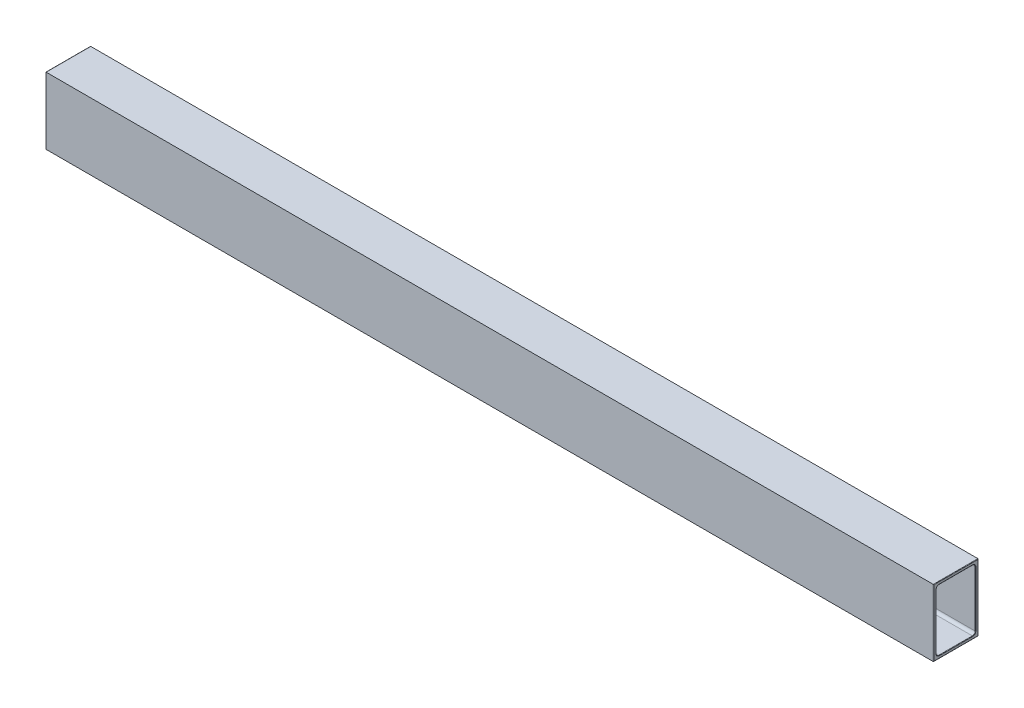
ISO-10303-21;
HEADER;
FILE_DESCRIPTION(('STEP AP214'),'2;1');
FILE_NAME('part.step','',(''),(''),'','','');
FILE_SCHEMA(('AUTOMOTIVE_DESIGN { 1 0 10303 214 1 1 1 1 }'));
ENDSEC;
DATA;
#1=APPLICATION_CONTEXT('core data for automotive mechanical design processes');
#2=APPLICATION_PROTOCOL_DEFINITION('international standard','automotive_design',2000,#1);
#3=PRODUCT_CONTEXT('',#1,'mechanical');
#4=PRODUCT('Part','Part','',(#3));
#5=PRODUCT_RELATED_PRODUCT_CATEGORY('part','',(#4));
#6=PRODUCT_DEFINITION_FORMATION('','',#4);
#7=PRODUCT_DEFINITION_CONTEXT('part definition',#1,'design');
#8=PRODUCT_DEFINITION('design','',#6,#7);
#9=PRODUCT_DEFINITION_SHAPE('','',#8);
#10=(LENGTH_UNIT() NAMED_UNIT(*) SI_UNIT(.MILLI.,.METRE.));
#11=(NAMED_UNIT(*) PLANE_ANGLE_UNIT() SI_UNIT($,.RADIAN.));
#12=(NAMED_UNIT(*) SI_UNIT($,.STERADIAN.) SOLID_ANGLE_UNIT());
#13=UNCERTAINTY_MEASURE_WITH_UNIT(LENGTH_MEASURE(1.E-05),#10,'distance_accuracy_value','');
#14=(GEOMETRIC_REPRESENTATION_CONTEXT(3) GLOBAL_UNCERTAINTY_ASSIGNED_CONTEXT((#13)) GLOBAL_UNIT_ASSIGNED_CONTEXT((#10,
#11,#12)) REPRESENTATION_CONTEXT('',''));
#15=CARTESIAN_POINT('',(0.,0.,0.));
#16=DIRECTION('',(0.,0.,1.));
#17=DIRECTION('',(1.,0.,0.));
#18=AXIS2_PLACEMENT_3D('',#15,#16,#17);
#19=CARTESIAN_POINT('',(2022.60499974,0.,0.));
#20=DIRECTION('',(0.,1.,0.));
#21=DIRECTION('',(0.,0.,1.));
#22=AXIS2_PLACEMENT_3D('',#19,#20,#21);
#23=PLANE('',#22);
#24=DIRECTION('',(0.,0.,-1.));
#25=VECTOR('',#24,1.);
#26=CARTESIAN_POINT('',(858.90249987,0.,0.));
#27=LINE('',#26,#25);
#28=CARTESIAN_POINT('',(858.90249987,0.,101.6));
#29=VERTEX_POINT('',#28);
#30=CARTESIAN_POINT('',(858.90249987,0.,0.));
#31=VERTEX_POINT('',#30);
#32=EDGE_CURVE('E11',#29,#31,#27,.T.);
#33=ORIENTED_EDGE('',*,*,#32,.F.);
#34=DIRECTION('',(-1.,0.,0.));
#35=VECTOR('',#34,1.);
#36=CARTESIAN_POINT('',(2022.60499974,0.,101.6));
#37=LINE('',#36,#35);
#38=CARTESIAN_POINT('',(0.99999999999989,0.,101.6));
#39=VERTEX_POINT('',#38);
#40=EDGE_CURVE('E448',#29,#39,#37,.T.);
#41=ORIENTED_EDGE('',*,*,#40,.T.);
#42=DIRECTION('',(0.,0.,-1.));
#43=VECTOR('',#42,1.);
#44=CARTESIAN_POINT('',(0.99999999999989,0.,0.));
#45=LINE('',#44,#43);
#46=CARTESIAN_POINT('',(0.99999999999989,0.,0.));
#47=VERTEX_POINT('',#46);
#48=EDGE_CURVE('E219',#39,#47,#45,.T.);
#49=ORIENTED_EDGE('',*,*,#48,.T.);
#50=DIRECTION('',(-1.,0.,0.));
#51=VECTOR('',#50,1.);
#52=CARTESIAN_POINT('',(2022.60499974,0.,0.));
#53=LINE('',#52,#51);
#54=EDGE_CURVE('E454',#31,#47,#53,.T.);
#55=ORIENTED_EDGE('',*,*,#54,.F.);
#56=EDGE_LOOP('',(#33,#41,#49,#55));
#57=FACE_BOUND('',#56,.T.);
#58=ADVANCED_FACE('F35',(#57),#23,.F.);
#59=DIRECTION('',(0.,0.,1.));
#60=VECTOR('',#59,1.);
#61=CARTESIAN_POINT('',(1163.70249987,0.,-1.87711285681846E-12));
#62=LINE('',#61,#60);
#63=CARTESIAN_POINT('',(1163.70249987,0.,0.));
#64=VERTEX_POINT('',#63);
#65=CARTESIAN_POINT('',(1163.70249987,0.,101.6));
#66=VERTEX_POINT('',#65);
#67=EDGE_CURVE('E44',#64,#66,#62,.T.);
#68=ORIENTED_EDGE('',*,*,#67,.F.);
#69=CARTESIAN_POINT('',(2021.60499974,0.,0.));
#70=VERTEX_POINT('',#69);
#71=EDGE_CURVE('E450',#70,#64,#53,.T.);
#72=ORIENTED_EDGE('',*,*,#71,.F.);
#73=DIRECTION('',(0.,0.,-1.));
#74=VECTOR('',#73,1.);
#75=CARTESIAN_POINT('',(2021.60499974,0.,101.6));
#76=LINE('',#75,#74);
#77=CARTESIAN_POINT('',(2021.60499974,0.,101.6));
#78=VERTEX_POINT('',#77);
#79=EDGE_CURVE('E303',#70,#78,#76,.F.);
#80=ORIENTED_EDGE('',*,*,#79,.T.);
#81=EDGE_CURVE('E443',#78,#66,#37,.T.);
#82=ORIENTED_EDGE('',*,*,#81,.T.);
#83=EDGE_LOOP('',(#68,#72,#80,#82));
#84=FACE_BOUND('',#83,.T.);
#85=ADVANCED_FACE('F567',(#84),#23,.F.);
#86=CARTESIAN_POINT('',(2022.60499974,0.,0.));
#87=DIRECTION('',(1.,0.,0.));
#88=DIRECTION('',(0.,0.,-1.));
#89=AXIS2_PLACEMENT_3D('',#86,#87,#88);
#90=PLANE('',#89);
#91=DIRECTION('',(0.,1.,0.));
#92=VECTOR('',#91,1.);
#93=CARTESIAN_POINT('',(2022.60499974,0.,5.35));
#94=LINE('',#93,#92);
#95=CARTESIAN_POINT('',(2022.60499974,139.7,5.34999999999999));
#96=VERTEX_POINT('',#95);
#97=CARTESIAN_POINT('',(2022.60499974,12.7,5.35));
#98=VERTEX_POINT('',#97);
#99=EDGE_CURVE('E271',#96,#98,#94,.F.);
#100=ORIENTED_EDGE('',*,*,#99,.T.);
#101=CARTESIAN_POINT('',(2022.60499974,12.7,12.7));
#102=DIRECTION('',(1.,0.,0.));
#103=DIRECTION('',(0.,0.,-1.));
#104=AXIS2_PLACEMENT_3D('',#101,#102,#103);
#105=CIRCLE('',#104,7.35);
#106=CARTESIAN_POINT('',(2022.60499974,5.35,12.7));
#107=VERTEX_POINT('',#106);
#108=EDGE_CURVE('E273',#98,#107,#105,.F.);
#109=ORIENTED_EDGE('',*,*,#108,.T.);
#110=DIRECTION('',(0.,0.,-1.));
#111=VECTOR('',#110,1.);
#112=CARTESIAN_POINT('',(2022.60499974,5.35,0.));
#113=LINE('',#112,#111);
#114=CARTESIAN_POINT('',(2022.60499974,5.34999999999999,88.9));
#115=VERTEX_POINT('',#114);
#116=EDGE_CURVE('E236',#107,#115,#113,.F.);
#117=ORIENTED_EDGE('',*,*,#116,.T.);
#118=CARTESIAN_POINT('',(2022.60499974,12.7,88.9));
#119=DIRECTION('',(1.,0.,0.));
#120=DIRECTION('',(0.,0.,-1.));
#121=AXIS2_PLACEMENT_3D('',#118,#119,#120);
#122=CIRCLE('',#121,7.35);
#123=CARTESIAN_POINT('',(2022.60499974,12.7,96.25));
#124=VERTEX_POINT('',#123);
#125=EDGE_CURVE('E261',#115,#124,#122,.F.);
#126=ORIENTED_EDGE('',*,*,#125,.T.);
#127=DIRECTION('',(0.,-1.,0.));
#128=VECTOR('',#127,1.);
#129=CARTESIAN_POINT('',(2022.60499974,0.,96.25));
#130=LINE('',#129,#128);
#131=CARTESIAN_POINT('',(2022.60499974,139.7,96.25));
#132=VERTEX_POINT('',#131);
#133=EDGE_CURVE('E263',#124,#132,#130,.F.);
#134=ORIENTED_EDGE('',*,*,#133,.T.);
#135=CARTESIAN_POINT('',(2022.60499974,139.7,88.9));
#136=DIRECTION('',(1.,0.,0.));
#137=DIRECTION('',(0.,0.,-1.));
#138=AXIS2_PLACEMENT_3D('',#135,#136,#137);
#139=CIRCLE('',#138,7.34999999999999);
#140=CARTESIAN_POINT('',(2022.60499974,147.05,88.9));
#141=VERTEX_POINT('',#140);
#142=EDGE_CURVE('E265',#132,#141,#139,.F.);
#143=ORIENTED_EDGE('',*,*,#142,.T.);
#144=DIRECTION('',(0.,0.,1.));
#145=VECTOR('',#144,1.);
#146=CARTESIAN_POINT('',(2022.60499974,147.05,1.07124865991555E-13));
#147=LINE('',#146,#145);
#148=CARTESIAN_POINT('',(2022.60499974,147.05,12.7));
#149=VERTEX_POINT('',#148);
#150=EDGE_CURVE('E267',#141,#149,#147,.F.);
#151=ORIENTED_EDGE('',*,*,#150,.T.);
#152=CARTESIAN_POINT('',(2022.60499974,139.7,12.7));
#153=DIRECTION('',(1.,0.,0.));
#154=DIRECTION('',(0.,0.,-1.));
#155=AXIS2_PLACEMENT_3D('',#152,#153,#154);
#156=CIRCLE('',#155,7.35000000000001);
#157=EDGE_CURVE('E269',#149,#96,#156,.F.);
#158=ORIENTED_EDGE('',*,*,#157,.T.);
#159=EDGE_LOOP('',(#100,#109,#117,#126,#134,#143,#151,#158));
#160=FACE_BOUND('',#159,.T.);
#161=DIRECTION('',(0.,-1.,0.));
#162=VECTOR('',#161,1.);
#163=CARTESIAN_POINT('',(2022.60499974,0.,100.6));
#164=LINE('',#163,#162);
#165=CARTESIAN_POINT('',(2022.60499974,151.4,100.6));
#166=VERTEX_POINT('',#165);
#167=CARTESIAN_POINT('',(2022.60499974,0.999999999999982,100.6));
#168=VERTEX_POINT('',#167);
#169=EDGE_CURVE('E255',#166,#168,#164,.T.);
#170=ORIENTED_EDGE('',*,*,#169,.T.);
#171=DIRECTION('',(0.,0.,-1.));
#172=VECTOR('',#171,1.);
#173=CARTESIAN_POINT('',(2022.60499974,1.,0.));
#174=LINE('',#173,#172);
#175=CARTESIAN_POINT('',(2022.60499974,1.,1.));
#176=VERTEX_POINT('',#175);
#177=EDGE_CURVE('E257',#168,#176,#174,.T.);
#178=ORIENTED_EDGE('',*,*,#177,.T.);
#179=DIRECTION('',(0.,1.,0.));
#180=VECTOR('',#179,1.);
#181=CARTESIAN_POINT('',(2022.60499974,152.4,1.));
#182=LINE('',#181,#180);
#183=CARTESIAN_POINT('',(2022.60499974,151.4,1.));
#184=VERTEX_POINT('',#183);
#185=EDGE_CURVE('E246',#176,#184,#182,.T.);
#186=ORIENTED_EDGE('',*,*,#185,.T.);
#187=DIRECTION('',(0.,0.,1.));
#188=VECTOR('',#187,1.);
#189=CARTESIAN_POINT('',(2022.60499974,151.4,101.6));
#190=LINE('',#189,#188);
#191=EDGE_CURVE('E248',#184,#166,#190,.T.);
#192=ORIENTED_EDGE('',*,*,#191,.T.);
#193=EDGE_LOOP('',(#170,#178,#186,#192));
#194=FACE_BOUND('',#193,.T.);
#195=ADVANCED_FACE('F537',(#160,#194),#90,.T.);
#196=CARTESIAN_POINT('',(0.,0.,0.));
#197=DIRECTION('',(1.,0.,0.));
#198=DIRECTION('',(0.,0.,-1.));
#199=AXIS2_PLACEMENT_3D('',#196,#197,#198);
#200=PLANE('',#199);
#201=CARTESIAN_POINT('',(0.,139.7,88.9));
#202=DIRECTION('',(1.,0.,0.));
#203=DIRECTION('',(0.,0.,-1.));
#204=AXIS2_PLACEMENT_3D('',#201,#202,#203);
#205=CIRCLE('',#204,7.34999999999999);
#206=CARTESIAN_POINT('',(0.,147.05,88.9));
#207=VERTEX_POINT('',#206);
#208=CARTESIAN_POINT('',(0.,139.7,96.25));
#209=VERTEX_POINT('',#208);
#210=EDGE_CURVE('E341',#207,#209,#205,.T.);
#211=ORIENTED_EDGE('',*,*,#210,.T.);
#212=DIRECTION('',(0.,-1.,0.));
#213=VECTOR('',#212,1.);
#214=CARTESIAN_POINT('',(0.,12.7,96.25));
#215=LINE('',#214,#213);
#216=CARTESIAN_POINT('',(0.,12.7,96.25));
#217=VERTEX_POINT('',#216);
#218=EDGE_CURVE('E343',#209,#217,#215,.T.);
#219=ORIENTED_EDGE('',*,*,#218,.T.);
#220=CARTESIAN_POINT('',(0.,12.7,88.9));
#221=DIRECTION('',(1.,0.,0.));
#222=DIRECTION('',(0.,0.,-1.));
#223=AXIS2_PLACEMENT_3D('',#220,#221,#222);
#224=CIRCLE('',#223,7.35);
#225=CARTESIAN_POINT('',(0.,5.34999999999999,88.9));
#226=VERTEX_POINT('',#225);
#227=EDGE_CURVE('E329',#217,#226,#224,.T.);
#228=ORIENTED_EDGE('',*,*,#227,.T.);
#229=DIRECTION('',(0.,0.,-1.));
#230=VECTOR('',#229,1.);
#231=CARTESIAN_POINT('',(0.,5.35,12.7));
#232=LINE('',#231,#230);
#233=CARTESIAN_POINT('',(0.,5.35,12.7));
#234=VERTEX_POINT('',#233);
#235=EDGE_CURVE('E331',#226,#234,#232,.T.);
#236=ORIENTED_EDGE('',*,*,#235,.T.);
#237=CARTESIAN_POINT('',(0.,12.7,12.7));
#238=DIRECTION('',(1.,0.,0.));
#239=DIRECTION('',(0.,0.,-1.));
#240=AXIS2_PLACEMENT_3D('',#237,#238,#239);
#241=CIRCLE('',#240,7.35);
#242=CARTESIAN_POINT('',(0.,12.7,5.35));
#243=VERTEX_POINT('',#242);
#244=EDGE_CURVE('E333',#234,#243,#241,.T.);
#245=ORIENTED_EDGE('',*,*,#244,.T.);
#246=DIRECTION('',(0.,1.,0.));
#247=VECTOR('',#246,1.);
#248=CARTESIAN_POINT('',(0.,139.7,5.35));
#249=LINE('',#248,#247);
#250=CARTESIAN_POINT('',(0.,139.7,5.35));
#251=VERTEX_POINT('',#250);
#252=EDGE_CURVE('E335',#243,#251,#249,.T.);
#253=ORIENTED_EDGE('',*,*,#252,.T.);
#254=CARTESIAN_POINT('',(0.,139.7,12.7));
#255=DIRECTION('',(1.,0.,0.));
#256=DIRECTION('',(0.,0.,-1.));
#257=AXIS2_PLACEMENT_3D('',#254,#255,#256);
#258=CIRCLE('',#257,7.35000000000001);
#259=CARTESIAN_POINT('',(0.,147.05,12.7));
#260=VERTEX_POINT('',#259);
#261=EDGE_CURVE('E337',#251,#260,#258,.T.);
#262=ORIENTED_EDGE('',*,*,#261,.T.);
#263=DIRECTION('',(0.,0.,1.));
#264=VECTOR('',#263,1.);
#265=CARTESIAN_POINT('',(0.,147.05,88.9));
#266=LINE('',#265,#264);
#267=EDGE_CURVE('E339',#260,#207,#266,.T.);
#268=ORIENTED_EDGE('',*,*,#267,.T.);
#269=EDGE_LOOP('',(#211,#219,#228,#236,#245,#253,#262,#268));
#270=FACE_BOUND('',#269,.T.);
#271=DIRECTION('',(0.,-1.,0.));
#272=VECTOR('',#271,1.);
#273=CARTESIAN_POINT('',(0.,0.,100.6));
#274=LINE('',#273,#272);
#275=CARTESIAN_POINT('',(0.,0.999999999999982,100.6));
#276=VERTEX_POINT('',#275);
#277=CARTESIAN_POINT('',(0.,151.4,100.6));
#278=VERTEX_POINT('',#277);
#279=EDGE_CURVE('E324',#276,#278,#274,.F.);
#280=ORIENTED_EDGE('',*,*,#279,.T.);
#281=DIRECTION('',(0.,0.,1.));
#282=VECTOR('',#281,1.);
#283=CARTESIAN_POINT('',(0.,151.4,0.));
#284=LINE('',#283,#282);
#285=CARTESIAN_POINT('',(0.,151.4,1.));
#286=VERTEX_POINT('',#285);
#287=EDGE_CURVE('E326',#278,#286,#284,.F.);
#288=ORIENTED_EDGE('',*,*,#287,.T.);
#289=DIRECTION('',(0.,1.,0.));
#290=VECTOR('',#289,1.);
#291=CARTESIAN_POINT('',(0.,0.,1.));
#292=LINE('',#291,#290);
#293=CARTESIAN_POINT('',(0.,1.,1.));
#294=VERTEX_POINT('',#293);
#295=EDGE_CURVE('E320',#286,#294,#292,.F.);
#296=ORIENTED_EDGE('',*,*,#295,.T.);
#297=DIRECTION('',(0.,0.,-1.));
#298=VECTOR('',#297,1.);
#299=CARTESIAN_POINT('',(0.,1.,0.));
#300=LINE('',#299,#298);
#301=EDGE_CURVE('E322',#294,#276,#300,.F.);
#302=ORIENTED_EDGE('',*,*,#301,.T.);
#303=EDGE_LOOP('',(#280,#288,#296,#302));
#304=FACE_BOUND('',#303,.T.);
#305=ADVANCED_FACE('F422',(#270,#304),#200,.F.);
#306=CARTESIAN_POINT('',(2022.60499974,0.,0.));
#307=DIRECTION('',(0.,0.,1.));
#308=DIRECTION('',(1.,0.,0.));
#309=AXIS2_PLACEMENT_3D('',#306,#307,#308);
#310=PLANE('',#309);
#311=DIRECTION('',(-1.,0.,0.));
#312=VECTOR('',#311,1.);
#313=CARTESIAN_POINT('',(2022.60499974,152.4,0.));
#314=LINE('',#313,#312);
#315=CARTESIAN_POINT('',(2021.60499974,152.4,0.));
#316=VERTEX_POINT('',#315);
#317=CARTESIAN_POINT('',(0.99999999999989,152.4,0.));
#318=VERTEX_POINT('',#317);
#319=EDGE_CURVE('E250',#316,#318,#314,.T.);
#320=ORIENTED_EDGE('',*,*,#319,.F.);
#321=DIRECTION('',(0.,1.,0.));
#322=VECTOR('',#321,1.);
#323=CARTESIAN_POINT('',(2021.60499974,0.,0.));
#324=LINE('',#323,#322);
#325=EDGE_CURVE('E318',#316,#70,#324,.F.);
#326=ORIENTED_EDGE('',*,*,#325,.T.);
#327=ORIENTED_EDGE('',*,*,#71,.T.);
#328=EDGE_CURVE('E453',#64,#31,#53,.T.);
#329=ORIENTED_EDGE('',*,*,#328,.T.);
#330=ORIENTED_EDGE('',*,*,#54,.T.);
#331=DIRECTION('',(0.,1.,0.));
#332=VECTOR('',#331,1.);
#333=CARTESIAN_POINT('',(0.99999999999989,0.,0.));
#334=LINE('',#333,#332);
#335=EDGE_CURVE('E316',#47,#318,#334,.T.);
#336=ORIENTED_EDGE('',*,*,#335,.T.);
#337=EDGE_LOOP('',(#320,#326,#327,#329,#330,#336));
#338=FACE_BOUND('',#337,.T.);
#339=ADVANCED_FACE('F584',(#338),#310,.F.);
#340=CARTESIAN_POINT('',(2022.60499974,152.4,0.));
#341=DIRECTION('',(0.,-1.,0.));
#342=DIRECTION('',(0.,0.,-1.));
#343=AXIS2_PLACEMENT_3D('',#340,#341,#342);
#344=PLANE('',#343);
#345=DIRECTION('',(-1.,0.,0.));
#346=VECTOR('',#345,1.);
#347=CARTESIAN_POINT('',(2022.60499974,152.4,101.6));
#348=LINE('',#347,#346);
#349=CARTESIAN_POINT('',(2021.60499974,152.4,101.6));
#350=VERTEX_POINT('',#349);
#351=CARTESIAN_POINT('',(0.99999999999989,152.4,101.6));
#352=VERTEX_POINT('',#351);
#353=EDGE_CURVE('E437',#350,#352,#348,.T.);
#354=ORIENTED_EDGE('',*,*,#353,.F.);
#355=DIRECTION('',(0.,0.,1.));
#356=VECTOR('',#355,1.);
#357=CARTESIAN_POINT('',(2021.60499974,152.4,0.));
#358=LINE('',#357,#356);
#359=EDGE_CURVE('E314',#350,#316,#358,.F.);
#360=ORIENTED_EDGE('',*,*,#359,.T.);
#361=ORIENTED_EDGE('',*,*,#319,.T.);
#362=DIRECTION('',(0.,0.,1.));
#363=VECTOR('',#362,1.);
#364=CARTESIAN_POINT('',(0.99999999999989,152.4,0.));
#365=LINE('',#364,#363);
#366=EDGE_CURVE('E311',#318,#352,#365,.T.);
#367=ORIENTED_EDGE('',*,*,#366,.T.);
#368=EDGE_LOOP('',(#354,#360,#361,#367));
#369=FACE_BOUND('',#368,.T.);
#370=ADVANCED_FACE('F436',(#369),#344,.F.);
#371=CARTESIAN_POINT('',(2022.60499974,0.,101.6));
#372=DIRECTION('',(0.,0.,-1.));
#373=DIRECTION('',(-1.,0.,0.));
#374=AXIS2_PLACEMENT_3D('',#371,#372,#373);
#375=PLANE('',#374);
#376=ORIENTED_EDGE('',*,*,#81,.F.);
#377=DIRECTION('',(0.,-1.,0.));
#378=VECTOR('',#377,1.);
#379=CARTESIAN_POINT('',(2021.60499974,152.4,101.6));
#380=LINE('',#379,#378);
#381=EDGE_CURVE('E309',#78,#350,#380,.F.);
#382=ORIENTED_EDGE('',*,*,#381,.T.);
#383=ORIENTED_EDGE('',*,*,#353,.T.);
#384=DIRECTION('',(0.,-1.,0.));
#385=VECTOR('',#384,1.);
#386=CARTESIAN_POINT('',(0.99999999999989,0.,101.6));
#387=LINE('',#386,#385);
#388=EDGE_CURVE('E306',#352,#39,#387,.T.);
#389=ORIENTED_EDGE('',*,*,#388,.T.);
#390=ORIENTED_EDGE('',*,*,#40,.F.);
#391=EDGE_CURVE('E446',#66,#29,#37,.T.);
#392=ORIENTED_EDGE('',*,*,#391,.F.);
#393=EDGE_LOOP('',(#376,#382,#383,#389,#390,#392));
#394=FACE_BOUND('',#393,.T.);
#395=ADVANCED_FACE('F441',(#394),#375,.F.);
#396=ORIENTED_EDGE('',*,*,#391,.T.);
#397=ORIENTED_EDGE('',*,*,#32,.T.);
#398=ORIENTED_EDGE('',*,*,#328,.F.);
#399=ORIENTED_EDGE('',*,*,#67,.T.);
#400=EDGE_LOOP('',(#396,#397,#398,#399));
#401=FACE_BOUND('',#400,.T.);
#402=ADVANCED_FACE('F569',(#401),#23,.F.);
#403=CARTESIAN_POINT('',(2022.60499974,12.7,88.9));
#404=DIRECTION('',(-1.,0.,0.));
#405=DIRECTION('',(0.,0.,1.));
#406=AXIS2_PLACEMENT_3D('',#403,#404,#405);
#407=CYLINDRICAL_SURFACE('',#406,6.35);
#408=DIRECTION('',(-1.,0.,0.));
#409=VECTOR('',#408,1.);
#410=CARTESIAN_POINT('',(2022.60499974,12.7,95.25));
#411=LINE('',#410,#409);
#412=CARTESIAN_POINT('',(2021.60499974,12.7,95.25));
#413=VERTEX_POINT('',#412);
#414=CARTESIAN_POINT('',(0.99999999999989,12.7,95.25));
#415=VERTEX_POINT('',#414);
#416=EDGE_CURVE('E364',#413,#415,#411,.T.);
#417=ORIENTED_EDGE('',*,*,#416,.F.);
#418=CARTESIAN_POINT('',(2021.60499974,12.7,88.9));
#419=DIRECTION('',(1.,0.,0.));
#420=DIRECTION('',(0.,0.,-1.));
#421=AXIS2_PLACEMENT_3D('',#418,#419,#420);
#422=CIRCLE('',#421,6.35);
#423=CARTESIAN_POINT('',(2021.60499974,6.34999999999999,88.9));
#424=VERTEX_POINT('',#423);
#425=EDGE_CURVE('E298',#413,#424,#422,.T.);
#426=ORIENTED_EDGE('',*,*,#425,.T.);
#427=DIRECTION('',(-1.,0.,0.));
#428=VECTOR('',#427,1.);
#429=CARTESIAN_POINT('',(2022.60499974,6.34999999999999,88.9));
#430=LINE('',#429,#428);
#431=CARTESIAN_POINT('',(0.99999999999989,6.34999999999999,88.9));
#432=VERTEX_POINT('',#431);
#433=EDGE_CURVE('E214',#424,#432,#430,.T.);
#434=ORIENTED_EDGE('',*,*,#433,.T.);
#435=CARTESIAN_POINT('',(0.99999999999989,12.7,88.9));
#436=DIRECTION('',(1.,0.,0.));
#437=DIRECTION('',(0.,0.,-1.));
#438=AXIS2_PLACEMENT_3D('',#435,#436,#437);
#439=CIRCLE('',#438,6.35);
#440=EDGE_CURVE('E296',#432,#415,#439,.F.);
#441=ORIENTED_EDGE('',*,*,#440,.T.);
#442=EDGE_LOOP('',(#417,#426,#434,#441));
#443=FACE_BOUND('',#442,.T.);
#444=ADVANCED_FACE('F530',(#443),#407,.F.);
#445=CARTESIAN_POINT('',(2022.60499974,6.35,12.7));
#446=DIRECTION('',(0.,1.,0.));
#447=DIRECTION('',(0.,0.,1.));
#448=AXIS2_PLACEMENT_3D('',#445,#446,#447);
#449=PLANE('',#448);
#450=ORIENTED_EDGE('',*,*,#433,.F.);
#451=DIRECTION('',(0.,0.,-1.));
#452=VECTOR('',#451,1.);
#453=CARTESIAN_POINT('',(2021.60499974,6.35,12.7));
#454=LINE('',#453,#452);
#455=CARTESIAN_POINT('',(2021.60499974,6.35,12.7));
#456=VERTEX_POINT('',#455);
#457=EDGE_CURVE('E208',#424,#456,#454,.T.);
#458=ORIENTED_EDGE('',*,*,#457,.T.);
#459=DIRECTION('',(-1.,0.,0.));
#460=VECTOR('',#459,1.);
#461=CARTESIAN_POINT('',(2022.60499974,6.35,12.7));
#462=LINE('',#461,#460);
#463=CARTESIAN_POINT('',(0.99999999999989,6.35,12.7));
#464=VERTEX_POINT('',#463);
#465=EDGE_CURVE('E211',#456,#464,#462,.T.);
#466=ORIENTED_EDGE('',*,*,#465,.T.);
#467=DIRECTION('',(0.,0.,-1.));
#468=VECTOR('',#467,1.);
#469=CARTESIAN_POINT('',(1.,6.34999999999999,88.9));
#470=LINE('',#469,#468);
#471=EDGE_CURVE('E220',#464,#432,#470,.F.);
#472=ORIENTED_EDGE('',*,*,#471,.T.);
#473=EDGE_LOOP('',(#450,#458,#466,#472));
#474=FACE_BOUND('',#473,.T.);
#475=ADVANCED_FACE('F210',(#474),#449,.T.);
#476=CARTESIAN_POINT('',(2022.60499974,12.7,12.7));
#477=DIRECTION('',(-1.,0.,0.));
#478=DIRECTION('',(0.,0.,1.));
#479=AXIS2_PLACEMENT_3D('',#476,#477,#478);
#480=CYLINDRICAL_SURFACE('',#479,6.35);
#481=ORIENTED_EDGE('',*,*,#465,.F.);
#482=CARTESIAN_POINT('',(2021.60499974,12.7,12.7));
#483=DIRECTION('',(1.,0.,0.));
#484=DIRECTION('',(0.,0.,-1.));
#485=AXIS2_PLACEMENT_3D('',#482,#483,#484);
#486=CIRCLE('',#485,6.35);
#487=CARTESIAN_POINT('',(2021.60499974,12.7,6.35));
#488=VERTEX_POINT('',#487);
#489=EDGE_CURVE('E227',#456,#488,#486,.T.);
#490=ORIENTED_EDGE('',*,*,#489,.T.);
#491=DIRECTION('',(-1.,0.,0.));
#492=VECTOR('',#491,1.);
#493=CARTESIAN_POINT('',(2022.60499974,12.7,6.35));
#494=LINE('',#493,#492);
#495=CARTESIAN_POINT('',(0.99999999999989,12.7,6.35));
#496=VERTEX_POINT('',#495);
#497=EDGE_CURVE('E231',#488,#496,#494,.T.);
#498=ORIENTED_EDGE('',*,*,#497,.T.);
#499=CARTESIAN_POINT('',(0.99999999999989,12.7,12.7));
#500=DIRECTION('',(1.,0.,0.));
#501=DIRECTION('',(0.,0.,-1.));
#502=AXIS2_PLACEMENT_3D('',#499,#500,#501);
#503=CIRCLE('',#502,6.35);
#504=EDGE_CURVE('E230',#496,#464,#503,.F.);
#505=ORIENTED_EDGE('',*,*,#504,.T.);
#506=EDGE_LOOP('',(#481,#490,#498,#505));
#507=FACE_BOUND('',#506,.T.);
#508=ADVANCED_FACE('F224',(#507),#480,.F.);
#509=CARTESIAN_POINT('',(2022.60499974,12.7,6.35));
#510=DIRECTION('',(0.,0.,1.));
#511=DIRECTION('',(0.,-1.,0.));
#512=AXIS2_PLACEMENT_3D('',#509,#510,#511);
#513=PLANE('',#512);
#514=ORIENTED_EDGE('',*,*,#497,.F.);
#515=DIRECTION('',(0.,1.,0.));
#516=VECTOR('',#515,1.);
#517=CARTESIAN_POINT('',(2021.60499974,12.7,6.35));
#518=LINE('',#517,#516);
#519=CARTESIAN_POINT('',(2021.60499974,139.7,6.34999999999999));
#520=VERTEX_POINT('',#519);
#521=EDGE_CURVE('E277',#488,#520,#518,.T.);
#522=ORIENTED_EDGE('',*,*,#521,.T.);
#523=DIRECTION('',(-1.,0.,0.));
#524=VECTOR('',#523,1.);
#525=CARTESIAN_POINT('',(2022.60499974,139.7,6.34999999999999));
#526=LINE('',#525,#524);
#527=CARTESIAN_POINT('',(0.99999999999989,139.7,6.34999999999999));
#528=VERTEX_POINT('',#527);
#529=EDGE_CURVE('E457',#520,#528,#526,.T.);
#530=ORIENTED_EDGE('',*,*,#529,.T.);
#531=DIRECTION('',(0.,1.,0.));
#532=VECTOR('',#531,1.);
#533=CARTESIAN_POINT('',(1.,12.7,6.35));
#534=LINE('',#533,#532);
#535=EDGE_CURVE('E275',#528,#496,#534,.F.);
#536=ORIENTED_EDGE('',*,*,#535,.T.);
#537=EDGE_LOOP('',(#514,#522,#530,#536));
#538=FACE_BOUND('',#537,.T.);
#539=ADVANCED_FACE('F519',(#538),#513,.T.);
#540=CARTESIAN_POINT('',(2022.60499974,139.7,12.7));
#541=DIRECTION('',(-1.,0.,0.));
#542=DIRECTION('',(0.,0.,1.));
#543=AXIS2_PLACEMENT_3D('',#540,#541,#542);
#544=CYLINDRICAL_SURFACE('',#543,6.35000000000001);
#545=ORIENTED_EDGE('',*,*,#529,.F.);
#546=CARTESIAN_POINT('',(2021.60499974,139.7,12.7));
#547=DIRECTION('',(1.,0.,0.));
#548=DIRECTION('',(0.,0.,-1.));
#549=AXIS2_PLACEMENT_3D('',#546,#547,#548);
#550=CIRCLE('',#549,6.35000000000001);
#551=CARTESIAN_POINT('',(2021.60499974,146.05,12.7));
#552=VERTEX_POINT('',#551);
#553=EDGE_CURVE('E281',#520,#552,#550,.T.);
#554=ORIENTED_EDGE('',*,*,#553,.T.);
#555=DIRECTION('',(-1.,0.,0.));
#556=VECTOR('',#555,1.);
#557=CARTESIAN_POINT('',(2022.60499974,146.05,12.7));
#558=LINE('',#557,#556);
#559=CARTESIAN_POINT('',(0.99999999999989,146.05,12.7));
#560=VERTEX_POINT('',#559);
#561=EDGE_CURVE('E460',#552,#560,#558,.T.);
#562=ORIENTED_EDGE('',*,*,#561,.T.);
#563=CARTESIAN_POINT('',(0.99999999999989,139.7,12.7));
#564=DIRECTION('',(1.,0.,0.));
#565=DIRECTION('',(0.,0.,-1.));
#566=AXIS2_PLACEMENT_3D('',#563,#564,#565);
#567=CIRCLE('',#566,6.35000000000001);
#568=EDGE_CURVE('E279',#560,#528,#567,.F.);
#569=ORIENTED_EDGE('',*,*,#568,.T.);
#570=EDGE_LOOP('',(#545,#554,#562,#569));
#571=FACE_BOUND('',#570,.T.);
#572=ADVANCED_FACE('F515',(#571),#544,.F.);
#573=CARTESIAN_POINT('',(2022.60499974,146.05,12.7));
#574=DIRECTION('',(0.,-1.,0.));
#575=DIRECTION('',(0.,0.,-1.));
#576=AXIS2_PLACEMENT_3D('',#573,#574,#575);
#577=PLANE('',#576);
#578=ORIENTED_EDGE('',*,*,#561,.F.);
#579=DIRECTION('',(0.,0.,1.));
#580=VECTOR('',#579,1.);
#581=CARTESIAN_POINT('',(2021.60499974,146.05,12.7));
#582=LINE('',#581,#580);
#583=CARTESIAN_POINT('',(2021.60499974,146.05,88.9));
#584=VERTEX_POINT('',#583);
#585=EDGE_CURVE('E285',#552,#584,#582,.T.);
#586=ORIENTED_EDGE('',*,*,#585,.T.);
#587=DIRECTION('',(-1.,0.,0.));
#588=VECTOR('',#587,1.);
#589=CARTESIAN_POINT('',(2022.60499974,146.05,88.9));
#590=LINE('',#589,#588);
#591=CARTESIAN_POINT('',(0.99999999999989,146.05,88.9));
#592=VERTEX_POINT('',#591);
#593=EDGE_CURVE('E463',#584,#592,#590,.T.);
#594=ORIENTED_EDGE('',*,*,#593,.T.);
#595=DIRECTION('',(0.,0.,1.));
#596=VECTOR('',#595,1.);
#597=CARTESIAN_POINT('',(1.,146.05,12.7));
#598=LINE('',#597,#596);
#599=EDGE_CURVE('E283',#592,#560,#598,.F.);
#600=ORIENTED_EDGE('',*,*,#599,.T.);
#601=EDGE_LOOP('',(#578,#586,#594,#600));
#602=FACE_BOUND('',#601,.T.);
#603=ADVANCED_FACE('F503',(#602),#577,.T.);
#604=CARTESIAN_POINT('',(2022.60499974,139.7,88.9));
#605=DIRECTION('',(-1.,0.,0.));
#606=DIRECTION('',(0.,0.,1.));
#607=AXIS2_PLACEMENT_3D('',#604,#605,#606);
#608=CYLINDRICAL_SURFACE('',#607,6.34999999999999);
#609=ORIENTED_EDGE('',*,*,#593,.F.);
#610=CARTESIAN_POINT('',(2021.60499974,139.7,88.9));
#611=DIRECTION('',(1.,0.,0.));
#612=DIRECTION('',(0.,0.,-1.));
#613=AXIS2_PLACEMENT_3D('',#610,#611,#612);
#614=CIRCLE('',#613,6.34999999999999);
#615=CARTESIAN_POINT('',(2021.60499974,139.7,95.25));
#616=VERTEX_POINT('',#615);
#617=EDGE_CURVE('E289',#584,#616,#614,.T.);
#618=ORIENTED_EDGE('',*,*,#617,.T.);
#619=DIRECTION('',(-1.,0.,0.));
#620=VECTOR('',#619,1.);
#621=CARTESIAN_POINT('',(2022.60499974,139.7,95.25));
#622=LINE('',#621,#620);
#623=CARTESIAN_POINT('',(0.99999999999989,139.7,95.25));
#624=VERTEX_POINT('',#623);
#625=EDGE_CURVE('E466',#616,#624,#622,.T.);
#626=ORIENTED_EDGE('',*,*,#625,.T.);
#627=CARTESIAN_POINT('',(0.99999999999989,139.7,88.9));
#628=DIRECTION('',(1.,0.,0.));
#629=DIRECTION('',(0.,0.,-1.));
#630=AXIS2_PLACEMENT_3D('',#627,#628,#629);
#631=CIRCLE('',#630,6.34999999999999);
#632=EDGE_CURVE('E287',#624,#592,#631,.F.);
#633=ORIENTED_EDGE('',*,*,#632,.T.);
#634=EDGE_LOOP('',(#609,#618,#626,#633));
#635=FACE_BOUND('',#634,.T.);
#636=ADVANCED_FACE('F498',(#635),#608,.F.);
#637=CARTESIAN_POINT('',(2022.60499974,12.7,95.25));
#638=DIRECTION('',(0.,0.,-1.));
#639=DIRECTION('',(-1.,0.,0.));
#640=AXIS2_PLACEMENT_3D('',#637,#638,#639);
#641=PLANE('',#640);
#642=ORIENTED_EDGE('',*,*,#625,.F.);
#643=DIRECTION('',(0.,-1.,0.));
#644=VECTOR('',#643,1.);
#645=CARTESIAN_POINT('',(2021.60499974,12.7,95.25));
#646=LINE('',#645,#644);
#647=EDGE_CURVE('E294',#616,#413,#646,.T.);
#648=ORIENTED_EDGE('',*,*,#647,.T.);
#649=ORIENTED_EDGE('',*,*,#416,.T.);
#650=DIRECTION('',(0.,-1.,0.));
#651=VECTOR('',#650,1.);
#652=CARTESIAN_POINT('',(1.,139.7,95.25));
#653=LINE('',#652,#651);
#654=EDGE_CURVE('E291',#415,#624,#653,.F.);
#655=ORIENTED_EDGE('',*,*,#654,.T.);
#656=EDGE_LOOP('',(#642,#648,#649,#655));
#657=FACE_BOUND('',#656,.T.);
#658=ADVANCED_FACE('F474',(#657),#641,.T.);
#659=CARTESIAN_POINT('',(2021.60499974,139.7,88.9));
#660=DIRECTION('',(1.,0.,0.));
#661=DIRECTION('',(0.,0.,-1.));
#662=AXIS2_PLACEMENT_3D('',#659,#660,#661);
#663=TOROIDAL_SURFACE('',#662,7.34999999999999,1.);
#664=CARTESIAN_POINT('',(2021.60499974,147.05,88.9));
#665=DIRECTION('',(0.,0.,-1.));
#666=DIRECTION('',(-1.,0.,0.));
#667=AXIS2_PLACEMENT_3D('',#664,#665,#666);
#668=CIRCLE('',#667,1.);
#669=EDGE_CURVE('E358',#141,#584,#668,.T.);
#670=ORIENTED_EDGE('',*,*,#669,.F.);
#671=ORIENTED_EDGE('',*,*,#142,.F.);
#672=CARTESIAN_POINT('',(2021.60499974,139.7,96.25));
#673=DIRECTION('',(0.,-1.,0.));
#674=DIRECTION('',(0.,0.,-1.));
#675=AXIS2_PLACEMENT_3D('',#672,#673,#674);
#676=CIRCLE('',#675,1.);
#677=EDGE_CURVE('E361',#616,#132,#676,.T.);
#678=ORIENTED_EDGE('',*,*,#677,.F.);
#679=ORIENTED_EDGE('',*,*,#617,.F.);
#680=EDGE_LOOP('',(#670,#671,#678,#679));
#681=FACE_BOUND('',#680,.T.);
#682=ADVANCED_FACE('F545',(#681),#663,.T.);
#683=CARTESIAN_POINT('',(2021.60499974,12.7,96.25));
#684=DIRECTION('',(0.,-1.,0.));
#685=DIRECTION('',(0.,0.,-1.));
#686=AXIS2_PLACEMENT_3D('',#683,#684,#685);
#687=CYLINDRICAL_SURFACE('',#686,1.);
#688=ORIENTED_EDGE('',*,*,#677,.T.);
#689=ORIENTED_EDGE('',*,*,#133,.F.);
#690=CARTESIAN_POINT('',(2021.60499974,12.7,96.25));
#691=DIRECTION('',(0.,-1.,0.));
#692=DIRECTION('',(0.,0.,-1.));
#693=AXIS2_PLACEMENT_3D('',#690,#691,#692);
#694=CIRCLE('',#693,1.);
#695=EDGE_CURVE('E355',#413,#124,#694,.T.);
#696=ORIENTED_EDGE('',*,*,#695,.F.);
#697=ORIENTED_EDGE('',*,*,#647,.F.);
#698=EDGE_LOOP('',(#688,#689,#696,#697));
#699=FACE_BOUND('',#698,.T.);
#700=ADVANCED_FACE('F541',(#699),#687,.T.);
#701=CARTESIAN_POINT('',(2021.60499974,147.05,12.7));
#702=DIRECTION('',(0.,0.,1.));
#703=DIRECTION('',(0.,-1.,0.));
#704=AXIS2_PLACEMENT_3D('',#701,#702,#703);
#705=CYLINDRICAL_SURFACE('',#704,1.);
#706=ORIENTED_EDGE('',*,*,#669,.T.);
#707=ORIENTED_EDGE('',*,*,#585,.F.);
#708=CARTESIAN_POINT('',(2021.60499974,147.05,12.7));
#709=DIRECTION('',(0.,0.,-1.));
#710=DIRECTION('',(-1.,0.,0.));
#711=AXIS2_PLACEMENT_3D('',#708,#709,#710);
#712=CIRCLE('',#711,1.);
#713=EDGE_CURVE('E352',#149,#552,#712,.T.);
#714=ORIENTED_EDGE('',*,*,#713,.F.);
#715=ORIENTED_EDGE('',*,*,#150,.F.);
#716=EDGE_LOOP('',(#706,#707,#714,#715));
#717=FACE_BOUND('',#716,.T.);
#718=ADVANCED_FACE('F551',(#717),#705,.T.);
#719=CARTESIAN_POINT('',(2021.60499974,12.7,88.9));
#720=DIRECTION('',(1.,0.,0.));
#721=DIRECTION('',(0.,0.,-1.));
#722=AXIS2_PLACEMENT_3D('',#719,#720,#721);
#723=TOROIDAL_SURFACE('',#722,7.35,1.);
#724=ORIENTED_EDGE('',*,*,#695,.T.);
#725=ORIENTED_EDGE('',*,*,#125,.F.);
#726=CARTESIAN_POINT('',(2021.60499974,5.34999999999999,88.9));
#727=DIRECTION('',(0.,0.,-1.));
#728=DIRECTION('',(-1.,0.,0.));
#729=AXIS2_PLACEMENT_3D('',#726,#727,#728);
#730=CIRCLE('',#729,1.);
#731=EDGE_CURVE('E350',#424,#115,#730,.T.);
#732=ORIENTED_EDGE('',*,*,#731,.F.);
#733=ORIENTED_EDGE('',*,*,#425,.F.);
#734=EDGE_LOOP('',(#724,#725,#732,#733));
#735=FACE_BOUND('',#734,.T.);
#736=ADVANCED_FACE('F533',(#735),#723,.T.);
#737=CARTESIAN_POINT('',(2021.60499974,139.7,12.7));
#738=DIRECTION('',(1.,0.,0.));
#739=DIRECTION('',(0.,0.,-1.));
#740=AXIS2_PLACEMENT_3D('',#737,#738,#739);
#741=TOROIDAL_SURFACE('',#740,7.35000000000001,1.);
#742=ORIENTED_EDGE('',*,*,#713,.T.);
#743=ORIENTED_EDGE('',*,*,#553,.F.);
#744=CARTESIAN_POINT('',(2021.60499974,139.7,5.34999999999999));
#745=DIRECTION('',(0.,-1.,0.));
#746=DIRECTION('',(0.,0.,-1.));
#747=AXIS2_PLACEMENT_3D('',#744,#745,#746);
#748=CIRCLE('',#747,1.);
#749=EDGE_CURVE('E240',#96,#520,#748,.T.);
#750=ORIENTED_EDGE('',*,*,#749,.F.);
#751=ORIENTED_EDGE('',*,*,#157,.F.);
#752=EDGE_LOOP('',(#742,#743,#750,#751));
#753=FACE_BOUND('',#752,.T.);
#754=ADVANCED_FACE('F553',(#753),#741,.T.);
#755=CARTESIAN_POINT('',(2021.60499974,5.35,12.7));
#756=DIRECTION('',(0.,0.,-1.));
#757=DIRECTION('',(0.,1.,0.));
#758=AXIS2_PLACEMENT_3D('',#755,#756,#757);
#759=CYLINDRICAL_SURFACE('',#758,1.);
#760=ORIENTED_EDGE('',*,*,#731,.T.);
#761=ORIENTED_EDGE('',*,*,#116,.F.);
#762=CARTESIAN_POINT('',(2021.60499974,5.35,12.7));
#763=DIRECTION('',(0.,0.,-1.));
#764=DIRECTION('',(-1.,0.,0.));
#765=AXIS2_PLACEMENT_3D('',#762,#763,#764);
#766=CIRCLE('',#765,1.);
#767=EDGE_CURVE('E234',#456,#107,#766,.T.);
#768=ORIENTED_EDGE('',*,*,#767,.F.);
#769=ORIENTED_EDGE('',*,*,#457,.F.);
#770=EDGE_LOOP('',(#760,#761,#768,#769));
#771=FACE_BOUND('',#770,.T.);
#772=ADVANCED_FACE('F235',(#771),#759,.T.);
#773=CARTESIAN_POINT('',(2021.60499974,12.7,5.35));
#774=DIRECTION('',(0.,1.,0.));
#775=DIRECTION('',(0.,0.,1.));
#776=AXIS2_PLACEMENT_3D('',#773,#774,#775);
#777=CYLINDRICAL_SURFACE('',#776,1.);
#778=ORIENTED_EDGE('',*,*,#749,.T.);
#779=ORIENTED_EDGE('',*,*,#521,.F.);
#780=CARTESIAN_POINT('',(2021.60499974,12.7,5.35));
#781=DIRECTION('',(0.,-1.,0.));
#782=DIRECTION('',(0.,0.,-1.));
#783=AXIS2_PLACEMENT_3D('',#780,#781,#782);
#784=CIRCLE('',#783,1.);
#785=EDGE_CURVE('E241',#98,#488,#784,.T.);
#786=ORIENTED_EDGE('',*,*,#785,.F.);
#787=ORIENTED_EDGE('',*,*,#99,.F.);
#788=EDGE_LOOP('',(#778,#779,#786,#787));
#789=FACE_BOUND('',#788,.T.);
#790=ADVANCED_FACE('F556',(#789),#777,.T.);
#791=CARTESIAN_POINT('',(2021.60499974,12.7,12.7));
#792=DIRECTION('',(1.,0.,0.));
#793=DIRECTION('',(0.,0.,-1.));
#794=AXIS2_PLACEMENT_3D('',#791,#792,#793);
#795=TOROIDAL_SURFACE('',#794,7.35,1.);
#796=ORIENTED_EDGE('',*,*,#767,.T.);
#797=ORIENTED_EDGE('',*,*,#108,.F.);
#798=ORIENTED_EDGE('',*,*,#785,.T.);
#799=ORIENTED_EDGE('',*,*,#489,.F.);
#800=EDGE_LOOP('',(#796,#797,#798,#799));
#801=FACE_BOUND('',#800,.T.);
#802=ADVANCED_FACE('F243',(#801),#795,.T.);
#803=CARTESIAN_POINT('',(2021.60499974,151.4,0.));
#804=DIRECTION('',(0.,0.,-1.));
#805=DIRECTION('',(0.,1.,0.));
#806=AXIS2_PLACEMENT_3D('',#803,#804,#805);
#807=CYLINDRICAL_SURFACE('',#806,1.);
#808=CARTESIAN_POINT('',(2021.60499974,151.4,1.));
#809=DIRECTION('',(0.,-0.707106781186547,-0.707106781186548));
#810=DIRECTION('',(0.,-0.707106781186548,0.707106781186547));
#811=AXIS2_PLACEMENT_3D('',#808,#809,#810);
#812=ELLIPSE('',#811,1.4142135623731,1.);
#813=EDGE_CURVE('E370',#316,#184,#812,.T.);
#814=ORIENTED_EDGE('',*,*,#813,.F.);
#815=ORIENTED_EDGE('',*,*,#359,.F.);
#816=CARTESIAN_POINT('',(2021.60499974,151.4,100.6));
#817=DIRECTION('',(0.,0.707106781186548,-0.707106781186547));
#818=DIRECTION('',(0.,-0.707106781186547,-0.707106781186548));
#819=AXIS2_PLACEMENT_3D('',#816,#817,#818);
#820=ELLIPSE('',#819,1.41421356237309,1.);
#821=EDGE_CURVE('E346',#166,#350,#820,.F.);
#822=ORIENTED_EDGE('',*,*,#821,.F.);
#823=ORIENTED_EDGE('',*,*,#191,.F.);
#824=EDGE_LOOP('',(#814,#815,#822,#823));
#825=FACE_BOUND('',#824,.T.);
#826=ADVANCED_FACE('F563',(#825),#807,.T.);
#827=CARTESIAN_POINT('',(2021.60499974,0.,100.6));
#828=DIRECTION('',(0.,1.,0.));
#829=DIRECTION('',(0.,0.,1.));
#830=AXIS2_PLACEMENT_3D('',#827,#828,#829);
#831=CYLINDRICAL_SURFACE('',#830,1.);
#832=ORIENTED_EDGE('',*,*,#821,.T.);
#833=ORIENTED_EDGE('',*,*,#381,.F.);
#834=CARTESIAN_POINT('',(2021.60499974,0.999999999999982,100.6));
#835=DIRECTION('',(0.,0.707106781186547,0.707106781186548));
#836=DIRECTION('',(0.,0.707106781186548,-0.707106781186547));
#837=AXIS2_PLACEMENT_3D('',#834,#835,#836);
#838=ELLIPSE('',#837,1.4142135623731,1.);
#839=EDGE_CURVE('E367',#168,#78,#838,.F.);
#840=ORIENTED_EDGE('',*,*,#839,.F.);
#841=ORIENTED_EDGE('',*,*,#169,.F.);
#842=EDGE_LOOP('',(#832,#833,#840,#841));
#843=FACE_BOUND('',#842,.T.);
#844=ADVANCED_FACE('F601',(#843),#831,.T.);
#845=CARTESIAN_POINT('',(2021.60499974,0.,1.));
#846=DIRECTION('',(0.,-1.,0.));
#847=DIRECTION('',(0.,0.,-1.));
#848=AXIS2_PLACEMENT_3D('',#845,#846,#847);
#849=CYLINDRICAL_SURFACE('',#848,1.);
#850=ORIENTED_EDGE('',*,*,#813,.T.);
#851=ORIENTED_EDGE('',*,*,#185,.F.);
#852=CARTESIAN_POINT('',(2021.60499974,1.,1.));
#853=DIRECTION('',(0.,-0.707106781186548,0.707106781186547));
#854=DIRECTION('',(0.,-0.707106781186547,-0.707106781186548));
#855=AXIS2_PLACEMENT_3D('',#852,#853,#854);
#856=ELLIPSE('',#855,1.41421356237309,1.);
#857=EDGE_CURVE('E365',#70,#176,#856,.T.);
#858=ORIENTED_EDGE('',*,*,#857,.F.);
#859=ORIENTED_EDGE('',*,*,#325,.F.);
#860=EDGE_LOOP('',(#850,#851,#858,#859));
#861=FACE_BOUND('',#860,.T.);
#862=ADVANCED_FACE('F595',(#861),#849,.T.);
#863=CARTESIAN_POINT('',(2021.60499974,1.,0.));
#864=DIRECTION('',(0.,0.,1.));
#865=DIRECTION('',(0.,-1.,0.));
#866=AXIS2_PLACEMENT_3D('',#863,#864,#865);
#867=CYLINDRICAL_SURFACE('',#866,1.);
#868=ORIENTED_EDGE('',*,*,#839,.T.);
#869=ORIENTED_EDGE('',*,*,#79,.F.);
#870=ORIENTED_EDGE('',*,*,#857,.T.);
#871=ORIENTED_EDGE('',*,*,#177,.F.);
#872=EDGE_LOOP('',(#868,#869,#870,#871));
#873=FACE_BOUND('',#872,.T.);
#874=ADVANCED_FACE('F590',(#873),#867,.T.);
#875=CARTESIAN_POINT('',(1.,0.,5.35));
#876=DIRECTION('',(0.,-1.,0.));
#877=DIRECTION('',(0.,0.,-1.));
#878=AXIS2_PLACEMENT_3D('',#875,#876,#877);
#879=CYLINDRICAL_SURFACE('',#878,1.);
#880=CARTESIAN_POINT('',(1.,12.7,5.35));
#881=DIRECTION('',(0.,-1.,0.));
#882=DIRECTION('',(0.,0.,-1.));
#883=AXIS2_PLACEMENT_3D('',#880,#881,#882);
#884=CIRCLE('',#883,1.);
#885=EDGE_CURVE('E392',#496,#243,#884,.T.);
#886=ORIENTED_EDGE('',*,*,#885,.F.);
#887=ORIENTED_EDGE('',*,*,#535,.F.);
#888=CARTESIAN_POINT('',(1.,139.7,5.35));
#889=DIRECTION('',(0.,1.,0.));
#890=DIRECTION('',(0.,0.,1.));
#891=AXIS2_PLACEMENT_3D('',#888,#889,#890);
#892=CIRCLE('',#891,1.);
#893=EDGE_CURVE('E368',#251,#528,#892,.T.);
#894=ORIENTED_EDGE('',*,*,#893,.F.);
#895=ORIENTED_EDGE('',*,*,#252,.F.);
#896=EDGE_LOOP('',(#886,#887,#894,#895));
#897=FACE_BOUND('',#896,.T.);
#898=ADVANCED_FACE('F522',(#897),#879,.T.);
#899=CARTESIAN_POINT('',(0.99999999999989,139.7,12.7));
#900=DIRECTION('',(1.,0.,0.));
#901=DIRECTION('',(0.,0.,-1.));
#902=AXIS2_PLACEMENT_3D('',#899,#900,#901);
#903=TOROIDAL_SURFACE('',#902,7.35000000000001,1.);
#904=ORIENTED_EDGE('',*,*,#893,.T.);
#905=ORIENTED_EDGE('',*,*,#568,.F.);
#906=CARTESIAN_POINT('',(1.,147.05,12.7));
#907=DIRECTION('',(0.,0.,1.));
#908=DIRECTION('',(1.,0.,0.));
#909=AXIS2_PLACEMENT_3D('',#906,#907,#908);
#910=CIRCLE('',#909,1.);
#911=EDGE_CURVE('E389',#260,#560,#910,.T.);
#912=ORIENTED_EDGE('',*,*,#911,.F.);
#913=ORIENTED_EDGE('',*,*,#261,.F.);
#914=EDGE_LOOP('',(#904,#905,#912,#913));
#915=FACE_BOUND('',#914,.T.);
#916=ADVANCED_FACE('F511',(#915),#903,.T.);
#917=CARTESIAN_POINT('',(0.99999999999989,12.7,12.7));
#918=DIRECTION('',(1.,0.,0.));
#919=DIRECTION('',(0.,0.,-1.));
#920=AXIS2_PLACEMENT_3D('',#917,#918,#919);
#921=TOROIDAL_SURFACE('',#920,7.35,1.);
#922=ORIENTED_EDGE('',*,*,#885,.T.);
#923=ORIENTED_EDGE('',*,*,#244,.F.);
#924=CARTESIAN_POINT('',(0.99999999999989,5.35,12.7));
#925=DIRECTION('',(0.,0.,1.));
#926=DIRECTION('',(1.,0.,0.));
#927=AXIS2_PLACEMENT_3D('',#924,#925,#926);
#928=CIRCLE('',#927,1.);
#929=EDGE_CURVE('E386',#464,#234,#928,.T.);
#930=ORIENTED_EDGE('',*,*,#929,.F.);
#931=ORIENTED_EDGE('',*,*,#504,.F.);
#932=EDGE_LOOP('',(#922,#923,#930,#931));
#933=FACE_BOUND('',#932,.T.);
#934=ADVANCED_FACE('F526',(#933),#921,.T.);
#935=CARTESIAN_POINT('',(1.,147.05,1.07124865991555E-13));
#936=DIRECTION('',(0.,0.,-1.));
#937=DIRECTION('',(0.,1.,0.));
#938=AXIS2_PLACEMENT_3D('',#935,#936,#937);
#939=CYLINDRICAL_SURFACE('',#938,1.);
#940=ORIENTED_EDGE('',*,*,#911,.T.);
#941=ORIENTED_EDGE('',*,*,#599,.F.);
#942=CARTESIAN_POINT('',(1.,147.05,88.9));
#943=DIRECTION('',(0.,0.,1.));
#944=DIRECTION('',(1.,0.,0.));
#945=AXIS2_PLACEMENT_3D('',#942,#943,#944);
#946=CIRCLE('',#945,1.);
#947=EDGE_CURVE('E383',#207,#592,#946,.T.);
#948=ORIENTED_EDGE('',*,*,#947,.F.);
#949=ORIENTED_EDGE('',*,*,#267,.F.);
#950=EDGE_LOOP('',(#940,#941,#948,#949));
#951=FACE_BOUND('',#950,.T.);
#952=ADVANCED_FACE('F506',(#951),#939,.T.);
#953=CARTESIAN_POINT('',(1.,5.35,0.));
#954=DIRECTION('',(0.,0.,1.));
#955=DIRECTION('',(0.,-1.,0.));
#956=AXIS2_PLACEMENT_3D('',#953,#954,#955);
#957=CYLINDRICAL_SURFACE('',#956,1.);
#958=ORIENTED_EDGE('',*,*,#929,.T.);
#959=ORIENTED_EDGE('',*,*,#235,.F.);
#960=CARTESIAN_POINT('',(1.,5.34999999999999,88.9));
#961=DIRECTION('',(0.,0.,1.));
#962=DIRECTION('',(1.,0.,0.));
#963=AXIS2_PLACEMENT_3D('',#960,#961,#962);
#964=CIRCLE('',#963,1.);
#965=EDGE_CURVE('E380',#432,#226,#964,.T.);
#966=ORIENTED_EDGE('',*,*,#965,.F.);
#967=ORIENTED_EDGE('',*,*,#471,.F.);
#968=EDGE_LOOP('',(#958,#959,#966,#967));
#969=FACE_BOUND('',#968,.T.);
#970=ADVANCED_FACE('F529',(#969),#957,.T.);
#971=CARTESIAN_POINT('',(0.99999999999989,139.7,88.9));
#972=DIRECTION('',(1.,0.,0.));
#973=DIRECTION('',(0.,0.,-1.));
#974=AXIS2_PLACEMENT_3D('',#971,#972,#973);
#975=TOROIDAL_SURFACE('',#974,7.34999999999999,1.);
#976=ORIENTED_EDGE('',*,*,#947,.T.);
#977=ORIENTED_EDGE('',*,*,#632,.F.);
#978=CARTESIAN_POINT('',(1.,139.7,96.25));
#979=DIRECTION('',(0.,-1.,0.));
#980=DIRECTION('',(0.,0.,-1.));
#981=AXIS2_PLACEMENT_3D('',#978,#979,#980);
#982=CIRCLE('',#981,1.);
#983=EDGE_CURVE('E377',#209,#624,#982,.T.);
#984=ORIENTED_EDGE('',*,*,#983,.F.);
#985=ORIENTED_EDGE('',*,*,#210,.F.);
#986=EDGE_LOOP('',(#976,#977,#984,#985));
#987=FACE_BOUND('',#986,.T.);
#988=ADVANCED_FACE('F495',(#987),#975,.T.);
#989=CARTESIAN_POINT('',(0.99999999999989,12.7,88.9));
#990=DIRECTION('',(1.,0.,0.));
#991=DIRECTION('',(0.,0.,-1.));
#992=AXIS2_PLACEMENT_3D('',#989,#990,#991);
#993=TOROIDAL_SURFACE('',#992,7.35,1.);
#994=ORIENTED_EDGE('',*,*,#965,.T.);
#995=ORIENTED_EDGE('',*,*,#227,.F.);
#996=CARTESIAN_POINT('',(0.99999999999989,12.7,96.25));
#997=DIRECTION('',(0.,1.,0.));
#998=DIRECTION('',(0.,0.,1.));
#999=AXIS2_PLACEMENT_3D('',#996,#997,#998);
#1000=CIRCLE('',#999,1.);
#1001=EDGE_CURVE('E375',#415,#217,#1000,.T.);
#1002=ORIENTED_EDGE('',*,*,#1001,.F.);
#1003=ORIENTED_EDGE('',*,*,#440,.F.);
#1004=EDGE_LOOP('',(#994,#995,#1002,#1003));
#1005=FACE_BOUND('',#1004,.T.);
#1006=ADVANCED_FACE('F487',(#1005),#993,.T.);
#1007=CARTESIAN_POINT('',(1.,0.,96.25));
#1008=DIRECTION('',(0.,1.,0.));
#1009=DIRECTION('',(0.,0.,1.));
#1010=AXIS2_PLACEMENT_3D('',#1007,#1008,#1009);
#1011=CYLINDRICAL_SURFACE('',#1010,1.);
#1012=ORIENTED_EDGE('',*,*,#983,.T.);
#1013=ORIENTED_EDGE('',*,*,#654,.F.);
#1014=ORIENTED_EDGE('',*,*,#1001,.T.);
#1015=ORIENTED_EDGE('',*,*,#218,.F.);
#1016=EDGE_LOOP('',(#1012,#1013,#1014,#1015));
#1017=FACE_BOUND('',#1016,.T.);
#1018=ADVANCED_FACE('F480',(#1017),#1011,.T.);
#1019=CARTESIAN_POINT('',(0.99999999999989,1.,0.));
#1020=DIRECTION('',(0.,0.,-1.));
#1021=DIRECTION('',(0.,1.,0.));
#1022=AXIS2_PLACEMENT_3D('',#1019,#1020,#1021);
#1023=CYLINDRICAL_SURFACE('',#1022,1.);
#1024=CARTESIAN_POINT('',(0.99999999999989,0.999999999999982,100.6));
#1025=DIRECTION('',(0.,-0.707106781186547,-0.707106781186548));
#1026=DIRECTION('',(0.,0.707106781186548,-0.707106781186547));
#1027=AXIS2_PLACEMENT_3D('',#1024,#1025,#1026);
#1028=ELLIPSE('',#1027,1.4142135623731,1.);
#1029=EDGE_CURVE('E401',#276,#39,#1028,.F.);
#1030=ORIENTED_EDGE('',*,*,#1029,.F.);
#1031=ORIENTED_EDGE('',*,*,#301,.F.);
#1032=CARTESIAN_POINT('',(0.99999999999989,1.,1.));
#1033=DIRECTION('',(0.,0.707106781186548,-0.707106781186547));
#1034=DIRECTION('',(0.,0.707106781186547,0.707106781186548));
#1035=AXIS2_PLACEMENT_3D('',#1032,#1033,#1034);
#1036=ELLIPSE('',#1035,1.41421356237309,1.);
#1037=EDGE_CURVE('E378',#47,#294,#1036,.T.);
#1038=ORIENTED_EDGE('',*,*,#1037,.F.);
#1039=ORIENTED_EDGE('',*,*,#48,.F.);
#1040=EDGE_LOOP('',(#1030,#1031,#1038,#1039));
#1041=FACE_BOUND('',#1040,.T.);
#1042=ADVANCED_FACE('F37',(#1041),#1023,.T.);
#1043=CARTESIAN_POINT('',(0.99999999999989,0.,1.));
#1044=DIRECTION('',(0.,1.,0.));
#1045=DIRECTION('',(0.,0.,1.));
#1046=AXIS2_PLACEMENT_3D('',#1043,#1044,#1045);
#1047=CYLINDRICAL_SURFACE('',#1046,1.);
#1048=ORIENTED_EDGE('',*,*,#1037,.T.);
#1049=ORIENTED_EDGE('',*,*,#295,.F.);
#1050=CARTESIAN_POINT('',(0.99999999999989,151.4,1.));
#1051=DIRECTION('',(0.,0.707106781186547,0.707106781186548));
#1052=DIRECTION('',(0.,0.707106781186548,-0.707106781186547));
#1053=AXIS2_PLACEMENT_3D('',#1050,#1051,#1052);
#1054=ELLIPSE('',#1053,1.4142135623731,1.);
#1055=EDGE_CURVE('E399',#318,#286,#1054,.T.);
#1056=ORIENTED_EDGE('',*,*,#1055,.F.);
#1057=ORIENTED_EDGE('',*,*,#335,.F.);
#1058=EDGE_LOOP('',(#1048,#1049,#1056,#1057));
#1059=FACE_BOUND('',#1058,.T.);
#1060=ADVANCED_FACE('F414',(#1059),#1047,.T.);
#1061=CARTESIAN_POINT('',(0.99999999999989,0.,100.6));
#1062=DIRECTION('',(0.,-1.,0.));
#1063=DIRECTION('',(0.,0.,-1.));
#1064=AXIS2_PLACEMENT_3D('',#1061,#1062,#1063);
#1065=CYLINDRICAL_SURFACE('',#1064,1.);
#1066=ORIENTED_EDGE('',*,*,#1029,.T.);
#1067=ORIENTED_EDGE('',*,*,#388,.F.);
#1068=CARTESIAN_POINT('',(0.99999999999989,151.4,100.6));
#1069=DIRECTION('',(0.,-0.707106781186548,0.707106781186547));
#1070=DIRECTION('',(0.,-0.707106781186547,-0.707106781186548));
#1071=AXIS2_PLACEMENT_3D('',#1068,#1069,#1070);
#1072=ELLIPSE('',#1071,1.41421356237309,1.);
#1073=EDGE_CURVE('E397',#278,#352,#1072,.F.);
#1074=ORIENTED_EDGE('',*,*,#1073,.F.);
#1075=ORIENTED_EDGE('',*,*,#279,.F.);
#1076=EDGE_LOOP('',(#1066,#1067,#1074,#1075));
#1077=FACE_BOUND('',#1076,.T.);
#1078=ADVANCED_FACE('F430',(#1077),#1065,.T.);
#1079=CARTESIAN_POINT('',(0.99999999999989,151.4,0.));
#1080=DIRECTION('',(0.,0.,1.));
#1081=DIRECTION('',(0.,-1.,0.));
#1082=AXIS2_PLACEMENT_3D('',#1079,#1080,#1081);
#1083=CYLINDRICAL_SURFACE('',#1082,1.);
#1084=ORIENTED_EDGE('',*,*,#1055,.T.);
#1085=ORIENTED_EDGE('',*,*,#287,.F.);
#1086=ORIENTED_EDGE('',*,*,#1073,.T.);
#1087=ORIENTED_EDGE('',*,*,#366,.F.);
#1088=EDGE_LOOP('',(#1084,#1085,#1086,#1087));
#1089=FACE_BOUND('',#1088,.T.);
#1090=ADVANCED_FACE('F426',(#1089),#1083,.T.);
#1091=CLOSED_SHELL('',(#58,#85,#195,#305,#339,#370,#395,#402,#444,#475,#508,#539,#572,#603,#636,
#658,#682,#700,#718,#736,#754,#772,#790,#802,#826,#844,#862,#874,#898,#916,#934,#952,#970,#988,
#1006,#1018,#1042,#1060,#1078,#1090));
#1092=MANIFOLD_SOLID_BREP('B2',#1091);
#1093=ADVANCED_BREP_SHAPE_REPRESENTATION('',(#18,#1092),#14);
#1094=SHAPE_DEFINITION_REPRESENTATION(#9,#1093);
ENDSEC;
END-ISO-10303-21;
